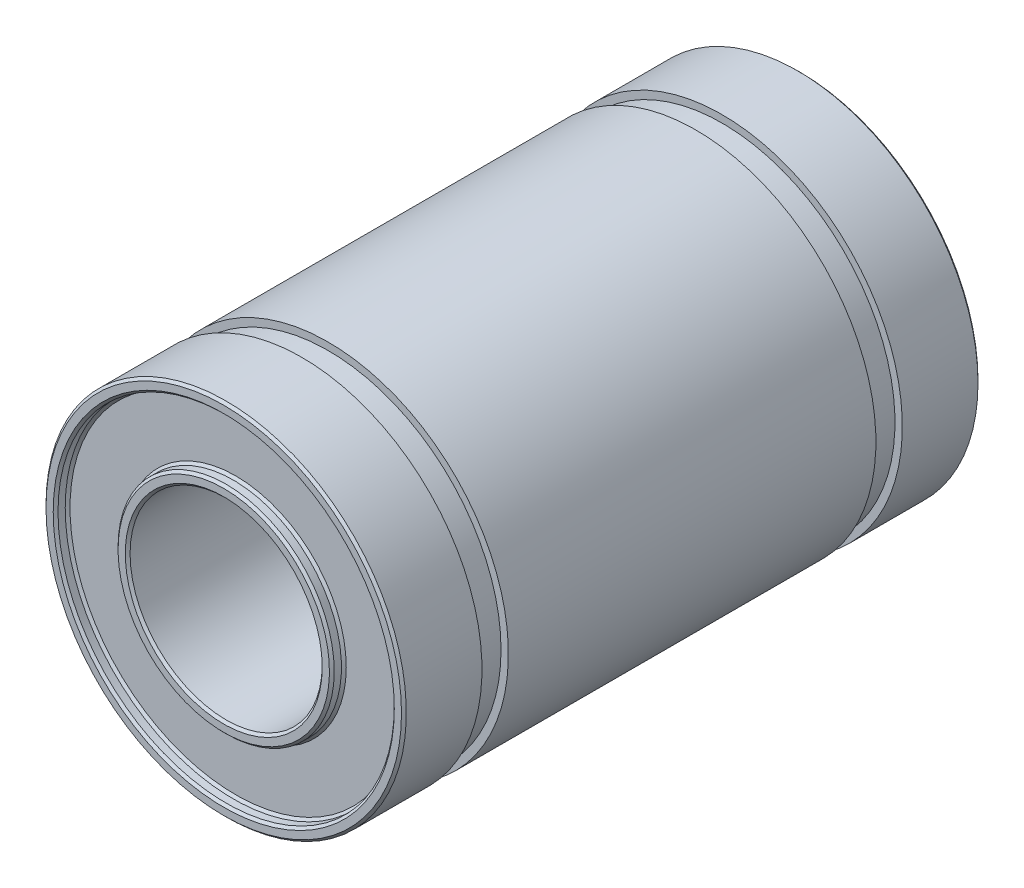
ISO-10303-21;
HEADER;
FILE_DESCRIPTION(('STEP AP214'),'2;1');
FILE_NAME('part.step','',(''),(''),'','','');
FILE_SCHEMA(('AUTOMOTIVE_DESIGN { 1 0 10303 214 1 1 1 1 }'));
ENDSEC;
DATA;
#1=APPLICATION_CONTEXT('core data for automotive mechanical design processes');
#2=APPLICATION_PROTOCOL_DEFINITION('international standard','automotive_design',2000,#1);
#3=PRODUCT_CONTEXT('',#1,'mechanical');
#4=PRODUCT('Part','Part','',(#3));
#5=PRODUCT_RELATED_PRODUCT_CATEGORY('part','',(#4));
#6=PRODUCT_DEFINITION_FORMATION('','',#4);
#7=PRODUCT_DEFINITION_CONTEXT('part definition',#1,'design');
#8=PRODUCT_DEFINITION('design','',#6,#7);
#9=PRODUCT_DEFINITION_SHAPE('','',#8);
#10=(LENGTH_UNIT() NAMED_UNIT(*) SI_UNIT(.MILLI.,.METRE.));
#11=(NAMED_UNIT(*) PLANE_ANGLE_UNIT() SI_UNIT($,.RADIAN.));
#12=(NAMED_UNIT(*) SI_UNIT($,.STERADIAN.) SOLID_ANGLE_UNIT());
#13=UNCERTAINTY_MEASURE_WITH_UNIT(LENGTH_MEASURE(1.E-05),#10,'distance_accuracy_value','');
#14=(GEOMETRIC_REPRESENTATION_CONTEXT(3) GLOBAL_UNCERTAINTY_ASSIGNED_CONTEXT((#13)) GLOBAL_UNIT_ASSIGNED_CONTEXT((#10,
#11,#12)) REPRESENTATION_CONTEXT('',''));
#15=CARTESIAN_POINT('',(0.,0.,0.));
#16=DIRECTION('',(0.,0.,1.));
#17=DIRECTION('',(1.,0.,0.));
#18=AXIS2_PLACEMENT_3D('',#15,#16,#17);
#19=CARTESIAN_POINT('',(0.,0.,23.9999999998872));
#20=DIRECTION('',(0.,0.,1.));
#21=DIRECTION('',(1.,0.,0.));
#22=AXIS2_PLACEMENT_3D('',#19,#20,#21);
#23=CONICAL_SURFACE('',#22,4.09999999988031,0.785398163397448);
#24=CARTESIAN_POINT('',(0.,0.,23.9));
#25=DIRECTION('',(0.,0.,1.));
#26=DIRECTION('',(1.,0.,0.));
#27=AXIS2_PLACEMENT_3D('',#24,#25,#26);
#28=CIRCLE('',#27,4.);
#29=CARTESIAN_POINT('',(4.,0.,23.9));
#30=VERTEX_POINT('',#29);
#31=EDGE_CURVE('E29',#30,#30,#28,.F.);
#32=ORIENTED_EDGE('',*,*,#31,.T.);
#33=EDGE_LOOP('',(#32));
#34=FACE_BOUND('',#33,.T.);
#35=CARTESIAN_POINT('',(0.,0.,24.0000000000009));
#36=DIRECTION('',(0.,0.,1.));
#37=DIRECTION('',(1.,0.,0.));
#38=AXIS2_PLACEMENT_3D('',#35,#36,#37);
#39=CIRCLE('',#38,4.099999999994);
#40=CARTESIAN_POINT('',(4.099999999994,0.,24.0000000000009));
#41=VERTEX_POINT('',#40);
#42=EDGE_CURVE('E17',#41,#41,#39,.F.);
#43=ORIENTED_EDGE('',*,*,#42,.F.);
#44=EDGE_LOOP('',(#43));
#45=FACE_BOUND('',#44,.T.);
#46=ADVANCED_FACE('F14',(#34,#45),#23,.F.);
#47=CARTESIAN_POINT('',(0.,0.,0.));
#48=DIRECTION('',(0.,0.,1.));
#49=DIRECTION('',(1.,0.,0.));
#50=AXIS2_PLACEMENT_3D('',#47,#48,#49);
#51=CYLINDRICAL_SURFACE('',#50,4.);
#52=ORIENTED_EDGE('',*,*,#31,.F.);
#53=EDGE_LOOP('',(#52));
#54=FACE_BOUND('',#53,.T.);
#55=CARTESIAN_POINT('',(0.,0.,0.0999999999748979));
#56=DIRECTION('',(0.,0.,-1.));
#57=DIRECTION('',(-1.,0.,0.));
#58=AXIS2_PLACEMENT_3D('',#55,#56,#57);
#59=CIRCLE('',#58,3.99999999996226);
#60=CARTESIAN_POINT('',(-3.99999999996226,0.,0.0999999999748979));
#61=VERTEX_POINT('',#60);
#62=EDGE_CURVE('E89',#61,#61,#59,.T.);
#63=ORIENTED_EDGE('',*,*,#62,.T.);
#64=EDGE_LOOP('',(#63));
#65=FACE_BOUND('',#64,.T.);
#66=ADVANCED_FACE('F427',(#54,#65),#51,.F.);
#67=CARTESIAN_POINT('',(0.,0.,24.));
#68=DIRECTION('',(0.,0.,1.));
#69=DIRECTION('',(1.,0.,0.));
#70=AXIS2_PLACEMENT_3D('',#67,#68,#69);
#71=PLANE('',#70);
#72=ORIENTED_EDGE('',*,*,#42,.T.);
#73=EDGE_LOOP('',(#72));
#74=FACE_BOUND('',#73,.T.);
#75=CARTESIAN_POINT('',(0.,0.,24.0000000000578));
#76=DIRECTION('',(0.,0.,-1.));
#77=DIRECTION('',(0.,1.,0.));
#78=AXIS2_PLACEMENT_3D('',#75,#76,#77);
#79=CIRCLE('',#78,4.39999999997553);
#80=CARTESIAN_POINT('',(0.,4.39999999997553,24.0000000000578));
#81=VERTEX_POINT('',#80);
#82=EDGE_CURVE('E87',#81,#81,#79,.T.);
#83=ORIENTED_EDGE('',*,*,#82,.F.);
#84=EDGE_LOOP('',(#83));
#85=FACE_BOUND('',#84,.T.);
#86=ADVANCED_FACE('F418',(#74,#85),#71,.T.);
#87=CARTESIAN_POINT('',(0.,0.,0.));
#88=DIRECTION('',(0.,0.,-1.));
#89=DIRECTION('',(-1.,0.,0.));
#90=AXIS2_PLACEMENT_3D('',#87,#88,#89);
#91=CONICAL_SURFACE('',#90,4.099999999994,0.785398163397448);
#92=CARTESIAN_POINT('',(0.,0.,0.));
#93=DIRECTION('',(0.,0.,-1.));
#94=DIRECTION('',(-1.,0.,0.));
#95=AXIS2_PLACEMENT_3D('',#92,#93,#94);
#96=CIRCLE('',#95,4.099999999994);
#97=CARTESIAN_POINT('',(-4.099999999994,0.,0.));
#98=VERTEX_POINT('',#97);
#99=EDGE_CURVE('E85',#98,#98,#96,.T.);
#100=ORIENTED_EDGE('',*,*,#99,.T.);
#101=EDGE_LOOP('',(#100));
#102=FACE_BOUND('',#101,.T.);
#103=ORIENTED_EDGE('',*,*,#62,.F.);
#104=EDGE_LOOP('',(#103));
#105=FACE_BOUND('',#104,.T.);
#106=ADVANCED_FACE('F410',(#102,#105),#91,.F.);
#107=CARTESIAN_POINT('',(0.,0.,23.9000000000829));
#108=DIRECTION('',(0.,0.,-1.));
#109=DIRECTION('',(0.,1.,0.));
#110=AXIS2_PLACEMENT_3D('',#107,#108,#109);
#111=CONICAL_SURFACE('',#110,4.50000000000728,0.785398163681665);
#112=ORIENTED_EDGE('',*,*,#82,.T.);
#113=EDGE_LOOP('',(#112));
#114=FACE_BOUND('',#113,.T.);
#115=CARTESIAN_POINT('',(0.,0.,23.9));
#116=DIRECTION('',(0.,0.,-1.));
#117=DIRECTION('',(-1.,0.,0.));
#118=AXIS2_PLACEMENT_3D('',#115,#116,#117);
#119=CIRCLE('',#118,4.5);
#120=CARTESIAN_POINT('',(-4.5,0.,23.9));
#121=VERTEX_POINT('',#120);
#122=EDGE_CURVE('E84',#121,#121,#119,.T.);
#123=ORIENTED_EDGE('',*,*,#122,.F.);
#124=EDGE_LOOP('',(#123));
#125=FACE_BOUND('',#124,.T.);
#126=ADVANCED_FACE('F401',(#114,#125),#111,.T.);
#127=CARTESIAN_POINT('',(0.,0.,0.));
#128=DIRECTION('',(0.,0.,1.));
#129=DIRECTION('',(1.,0.,0.));
#130=AXIS2_PLACEMENT_3D('',#127,#128,#129);
#131=PLANE('',#130);
#132=CARTESIAN_POINT('',(0.,0.,-5.6843418860808E-11));
#133=DIRECTION('',(0.,0.,1.));
#134=DIRECTION('',(0.,-1.,0.));
#135=AXIS2_PLACEMENT_3D('',#132,#133,#134);
#136=CIRCLE('',#135,4.39999999997553);
#137=CARTESIAN_POINT('',(0.,-4.39999999997553,-5.68434122351281E-11));
#138=VERTEX_POINT('',#137);
#139=EDGE_CURVE('E80',#138,#138,#136,.T.);
#140=ORIENTED_EDGE('',*,*,#139,.F.);
#141=EDGE_LOOP('',(#140));
#142=FACE_BOUND('',#141,.T.);
#143=ORIENTED_EDGE('',*,*,#99,.F.);
#144=EDGE_LOOP('',(#143));
#145=FACE_BOUND('',#144,.T.);
#146=ADVANCED_FACE('F392',(#142,#145),#131,.F.);
#147=CARTESIAN_POINT('',(0.,0.,36.7279220613579));
#148=DIRECTION('',(0.,0.,-1.));
#149=DIRECTION('',(-1.,0.,0.));
#150=AXIS2_PLACEMENT_3D('',#147,#148,#149);
#151=CYLINDRICAL_SURFACE('',#150,4.5);
#152=ORIENTED_EDGE('',*,*,#122,.T.);
#153=EDGE_LOOP('',(#152));
#154=FACE_BOUND('',#153,.T.);
#155=CARTESIAN_POINT('',(0.,0.,23.6000000000445));
#156=DIRECTION('',(0.,0.,-1.));
#157=DIRECTION('',(-1.,0.,0.));
#158=AXIS2_PLACEMENT_3D('',#155,#156,#157);
#159=CIRCLE('',#158,4.50000000000728);
#160=CARTESIAN_POINT('',(-4.50000000000728,0.,23.6000000000445));
#161=VERTEX_POINT('',#160);
#162=EDGE_CURVE('E83',#161,#161,#159,.T.);
#163=ORIENTED_EDGE('',*,*,#162,.F.);
#164=EDGE_LOOP('',(#163));
#165=FACE_BOUND('',#164,.T.);
#166=ADVANCED_FACE('F383',(#154,#165),#151,.T.);
#167=CARTESIAN_POINT('',(0.,0.,0.0999999999748979));
#168=DIRECTION('',(0.,0.,1.));
#169=DIRECTION('',(0.,-1.,0.));
#170=AXIS2_PLACEMENT_3D('',#167,#168,#169);
#171=CONICAL_SURFACE('',#170,4.50000000000728,0.785398163397448);
#172=ORIENTED_EDGE('',*,*,#139,.T.);
#173=EDGE_LOOP('',(#172));
#174=FACE_BOUND('',#173,.T.);
#175=CARTESIAN_POINT('',(0.,0.,0.100000000000003));
#176=DIRECTION('',(0.,0.,1.));
#177=DIRECTION('',(1.,0.,0.));
#178=AXIS2_PLACEMENT_3D('',#175,#176,#177);
#179=CIRCLE('',#178,4.5);
#180=CARTESIAN_POINT('',(4.5,0.,0.100000000000003));
#181=VERTEX_POINT('',#180);
#182=EDGE_CURVE('E79',#181,#181,#179,.T.);
#183=ORIENTED_EDGE('',*,*,#182,.F.);
#184=EDGE_LOOP('',(#183));
#185=FACE_BOUND('',#184,.T.);
#186=ADVANCED_FACE('F374',(#174,#185),#171,.T.);
#187=CARTESIAN_POINT('',(0.,0.,23.5000000000127));
#188=DIRECTION('',(0.,0.,-1.));
#189=DIRECTION('',(-1.,0.,0.));
#190=AXIS2_PLACEMENT_3D('',#187,#188,#189);
#191=CONICAL_SURFACE('',#190,4.59999999998217,0.785398163113231);
#192=ORIENTED_EDGE('',*,*,#162,.T.);
#193=EDGE_LOOP('',(#192));
#194=FACE_BOUND('',#193,.T.);
#195=CARTESIAN_POINT('',(0.,0.,23.5000000000127));
#196=DIRECTION('',(0.,0.,-1.));
#197=DIRECTION('',(-1.,0.,0.));
#198=AXIS2_PLACEMENT_3D('',#195,#196,#197);
#199=CIRCLE('',#198,4.59999999998217);
#200=CARTESIAN_POINT('',(-4.59999999998217,0.,23.5000000000127));
#201=VERTEX_POINT('',#200);
#202=EDGE_CURVE('E76',#201,#201,#199,.T.);
#203=ORIENTED_EDGE('',*,*,#202,.F.);
#204=EDGE_LOOP('',(#203));
#205=FACE_BOUND('',#204,.T.);
#206=ADVANCED_FACE('F365',(#194,#205),#191,.T.);
#207=CARTESIAN_POINT('',(0.,0.,-12.7279220613579));
#208=DIRECTION('',(0.,0.,1.));
#209=DIRECTION('',(1.,0.,0.));
#210=AXIS2_PLACEMENT_3D('',#207,#208,#209);
#211=CYLINDRICAL_SURFACE('',#210,4.5);
#212=ORIENTED_EDGE('',*,*,#182,.T.);
#213=EDGE_LOOP('',(#212));
#214=FACE_BOUND('',#213,.T.);
#215=CARTESIAN_POINT('',(0.,0.,0.400000000013279));
#216=DIRECTION('',(0.,0.,1.));
#217=DIRECTION('',(1.,0.,0.));
#218=AXIS2_PLACEMENT_3D('',#215,#216,#217);
#219=CIRCLE('',#218,4.50000000000728);
#220=CARTESIAN_POINT('',(4.50000000000728,0.,0.400000000013279));
#221=VERTEX_POINT('',#220);
#222=EDGE_CURVE('E75',#221,#221,#219,.T.);
#223=ORIENTED_EDGE('',*,*,#222,.F.);
#224=EDGE_LOOP('',(#223));
#225=FACE_BOUND('',#224,.T.);
#226=ADVANCED_FACE('F167',(#214,#225),#211,.T.);
#227=CARTESIAN_POINT('',(0.,0.,23.5));
#228=DIRECTION('',(0.,0.,1.));
#229=DIRECTION('',(1.,0.,0.));
#230=AXIS2_PLACEMENT_3D('',#227,#228,#229);
#231=PLANE('',#230);
#232=CARTESIAN_POINT('',(0.,0.,23.5000000000127));
#233=DIRECTION('',(0.,0.,1.));
#234=DIRECTION('',(1.,0.,0.));
#235=AXIS2_PLACEMENT_3D('',#232,#233,#234);
#236=CIRCLE('',#235,6.9000000000301);
#237=CARTESIAN_POINT('',(6.9000000000301,0.,23.5000000000127));
#238=VERTEX_POINT('',#237);
#239=EDGE_CURVE('E72',#238,#238,#236,.T.);
#240=ORIENTED_EDGE('',*,*,#239,.T.);
#241=EDGE_LOOP('',(#240));
#242=FACE_BOUND('',#241,.T.);
#243=ORIENTED_EDGE('',*,*,#202,.T.);
#244=EDGE_LOOP('',(#243));
#245=FACE_BOUND('',#244,.T.);
#246=ADVANCED_FACE('F157',(#242,#245),#231,.T.);
#247=CARTESIAN_POINT('',(0.,0.,0.50000000004502));
#248=DIRECTION('',(0.,0.,1.));
#249=DIRECTION('',(1.,0.,0.));
#250=AXIS2_PLACEMENT_3D('',#247,#248,#249);
#251=CONICAL_SURFACE('',#250,4.60000000003902,0.785398163397448);
#252=ORIENTED_EDGE('',*,*,#222,.T.);
#253=EDGE_LOOP('',(#252));
#254=FACE_BOUND('',#253,.T.);
#255=CARTESIAN_POINT('',(0.,0.,0.50000000004502));
#256=DIRECTION('',(0.,0.,1.));
#257=DIRECTION('',(1.,0.,0.));
#258=AXIS2_PLACEMENT_3D('',#255,#256,#257);
#259=CIRCLE('',#258,4.60000000003902);
#260=CARTESIAN_POINT('',(4.60000000003902,0.,0.50000000004502));
#261=VERTEX_POINT('',#260);
#262=EDGE_CURVE('E69',#261,#261,#259,.T.);
#263=ORIENTED_EDGE('',*,*,#262,.F.);
#264=EDGE_LOOP('',(#263));
#265=FACE_BOUND('',#264,.T.);
#266=ADVANCED_FACE('F155',(#254,#265),#251,.T.);
#267=CARTESIAN_POINT('',(0.,0.,23.5999999999308));
#268=DIRECTION('',(0.,0.,1.));
#269=DIRECTION('',(1.,0.,0.));
#270=AXIS2_PLACEMENT_3D('',#267,#268,#269);
#271=CONICAL_SURFACE('',#270,6.99999999994816,0.785398163397448);
#272=ORIENTED_EDGE('',*,*,#239,.F.);
#273=EDGE_LOOP('',(#272));
#274=FACE_BOUND('',#273,.T.);
#275=CARTESIAN_POINT('',(0.,0.,23.6));
#276=DIRECTION('',(0.,0.,1.));
#277=DIRECTION('',(1.,0.,0.));
#278=AXIS2_PLACEMENT_3D('',#275,#276,#277);
#279=CIRCLE('',#278,7.);
#280=CARTESIAN_POINT('',(7.,0.,23.6));
#281=VERTEX_POINT('',#280);
#282=EDGE_CURVE('E68',#281,#281,#279,.T.);
#283=ORIENTED_EDGE('',*,*,#282,.T.);
#284=EDGE_LOOP('',(#283));
#285=FACE_BOUND('',#284,.T.);
#286=ADVANCED_FACE('F151',(#274,#285),#271,.F.);
#287=CARTESIAN_POINT('',(0.,0.,0.5));
#288=DIRECTION('',(0.,0.,-1.));
#289=DIRECTION('',(-1.,0.,0.));
#290=AXIS2_PLACEMENT_3D('',#287,#288,#289);
#291=PLANE('',#290);
#292=CARTESIAN_POINT('',(0.,0.,0.5));
#293=DIRECTION('',(0.,0.,-1.));
#294=DIRECTION('',(-1.,0.,0.));
#295=AXIS2_PLACEMENT_3D('',#292,#293,#294);
#296=CIRCLE('',#295,7.);
#297=CARTESIAN_POINT('',(-7.,0.,0.5));
#298=VERTEX_POINT('',#297);
#299=EDGE_CURVE('E64',#298,#298,#296,.T.);
#300=ORIENTED_EDGE('',*,*,#299,.T.);
#301=EDGE_LOOP('',(#300));
#302=FACE_BOUND('',#301,.T.);
#303=ORIENTED_EDGE('',*,*,#262,.T.);
#304=EDGE_LOOP('',(#303));
#305=FACE_BOUND('',#304,.T.);
#306=ADVANCED_FACE('F148',(#302,#305),#291,.T.);
#307=CARTESIAN_POINT('',(0.,0.,23.5));
#308=DIRECTION('',(0.,0.,1.));
#309=DIRECTION('',(1.,0.,0.));
#310=AXIS2_PLACEMENT_3D('',#307,#308,#309);
#311=CYLINDRICAL_SURFACE('',#310,7.);
#312=ORIENTED_EDGE('',*,*,#282,.F.);
#313=EDGE_LOOP('',(#312));
#314=FACE_BOUND('',#313,.T.);
#315=CARTESIAN_POINT('',(0.,0.,23.9));
#316=DIRECTION('',(0.,0.,1.));
#317=DIRECTION('',(1.,0.,0.));
#318=AXIS2_PLACEMENT_3D('',#315,#316,#317);
#319=CIRCLE('',#318,7.);
#320=CARTESIAN_POINT('',(7.,0.,23.9));
#321=VERTEX_POINT('',#320);
#322=EDGE_CURVE('E67',#321,#321,#319,.T.);
#323=ORIENTED_EDGE('',*,*,#322,.T.);
#324=EDGE_LOOP('',(#323));
#325=FACE_BOUND('',#324,.T.);
#326=ADVANCED_FACE('F144',(#314,#325),#311,.F.);
#327=CARTESIAN_POINT('',(0.,0.,0.5));
#328=DIRECTION('',(0.,0.,-1.));
#329=DIRECTION('',(-1.,0.,0.));
#330=AXIS2_PLACEMENT_3D('',#327,#328,#329);
#331=CYLINDRICAL_SURFACE('',#330,7.);
#332=CARTESIAN_POINT('',(0.,0.,0.0999999999999951));
#333=DIRECTION('',(0.,0.,-1.));
#334=DIRECTION('',(-1.,0.,0.));
#335=AXIS2_PLACEMENT_3D('',#332,#333,#334);
#336=CIRCLE('',#335,7.);
#337=CARTESIAN_POINT('',(-7.,0.,0.0999999999999951));
#338=VERTEX_POINT('',#337);
#339=EDGE_CURVE('E63',#338,#338,#336,.T.);
#340=ORIENTED_EDGE('',*,*,#339,.T.);
#341=EDGE_LOOP('',(#340));
#342=FACE_BOUND('',#341,.T.);
#343=ORIENTED_EDGE('',*,*,#299,.F.);
#344=EDGE_LOOP('',(#343));
#345=FACE_BOUND('',#344,.T.);
#346=ADVANCED_FACE('F141',(#342,#345),#331,.F.);
#347=CARTESIAN_POINT('',(0.,0.,24.));
#348=DIRECTION('',(0.,0.,1.));
#349=DIRECTION('',(1.,0.,0.));
#350=AXIS2_PLACEMENT_3D('',#347,#348,#349);
#351=CONICAL_SURFACE('',#350,7.10000000000001,0.785398163397448);
#352=ORIENTED_EDGE('',*,*,#322,.F.);
#353=EDGE_LOOP('',(#352));
#354=FACE_BOUND('',#353,.T.);
#355=CARTESIAN_POINT('',(0.,0.,24.));
#356=DIRECTION('',(0.,0.,1.));
#357=DIRECTION('',(1.,0.,0.));
#358=AXIS2_PLACEMENT_3D('',#355,#356,#357);
#359=CIRCLE('',#358,7.10000000000001);
#360=CARTESIAN_POINT('',(7.10000000000001,0.,24.));
#361=VERTEX_POINT('',#360);
#362=EDGE_CURVE('E60',#361,#361,#359,.F.);
#363=ORIENTED_EDGE('',*,*,#362,.F.);
#364=EDGE_LOOP('',(#363));
#365=FACE_BOUND('',#364,.T.);
#366=ADVANCED_FACE('F137',(#354,#365),#351,.F.);
#367=CARTESIAN_POINT('',(0.,0.,0.));
#368=DIRECTION('',(0.,0.,-1.));
#369=DIRECTION('',(0.,1.,0.));
#370=AXIS2_PLACEMENT_3D('',#367,#368,#369);
#371=CONICAL_SURFACE('',#370,7.1,0.785398163397466);
#372=CARTESIAN_POINT('',(0.,0.,0.));
#373=DIRECTION('',(0.,0.,-1.));
#374=DIRECTION('',(0.,1.,0.));
#375=AXIS2_PLACEMENT_3D('',#372,#373,#374);
#376=CIRCLE('',#375,7.1);
#377=CARTESIAN_POINT('',(0.,7.1,0.));
#378=VERTEX_POINT('',#377);
#379=EDGE_CURVE('E57',#378,#378,#376,.T.);
#380=ORIENTED_EDGE('',*,*,#379,.T.);
#381=EDGE_LOOP('',(#380));
#382=FACE_BOUND('',#381,.T.);
#383=ORIENTED_EDGE('',*,*,#339,.F.);
#384=EDGE_LOOP('',(#383));
#385=FACE_BOUND('',#384,.T.);
#386=ADVANCED_FACE('F134',(#382,#385),#371,.F.);
#387=CARTESIAN_POINT('',(0.,0.,24.));
#388=DIRECTION('',(0.,0.,1.));
#389=DIRECTION('',(1.,0.,0.));
#390=AXIS2_PLACEMENT_3D('',#387,#388,#389);
#391=PLANE('',#390);
#392=ORIENTED_EDGE('',*,*,#362,.T.);
#393=EDGE_LOOP('',(#392));
#394=FACE_BOUND('',#393,.T.);
#395=CARTESIAN_POINT('',(0.,0.,24.));
#396=DIRECTION('',(0.,0.,-1.));
#397=DIRECTION('',(-1.,0.,0.));
#398=AXIS2_PLACEMENT_3D('',#395,#396,#397);
#399=CIRCLE('',#398,7.39999999999999);
#400=CARTESIAN_POINT('',(-7.39999999999999,0.,24.));
#401=VERTEX_POINT('',#400);
#402=EDGE_CURVE('E54',#401,#401,#399,.T.);
#403=ORIENTED_EDGE('',*,*,#402,.F.);
#404=EDGE_LOOP('',(#403));
#405=FACE_BOUND('',#404,.T.);
#406=ADVANCED_FACE('F130',(#394,#405),#391,.T.);
#407=CARTESIAN_POINT('',(0.,0.,0.));
#408=DIRECTION('',(0.,0.,1.));
#409=DIRECTION('',(1.,0.,0.));
#410=AXIS2_PLACEMENT_3D('',#407,#408,#409);
#411=PLANE('',#410);
#412=CARTESIAN_POINT('',(0.,0.,0.));
#413=DIRECTION('',(0.,0.,1.));
#414=DIRECTION('',(1.,0.,0.));
#415=AXIS2_PLACEMENT_3D('',#412,#413,#414);
#416=CIRCLE('',#415,7.4);
#417=CARTESIAN_POINT('',(7.4,0.,0.));
#418=VERTEX_POINT('',#417);
#419=EDGE_CURVE('E50',#418,#418,#416,.T.);
#420=ORIENTED_EDGE('',*,*,#419,.F.);
#421=EDGE_LOOP('',(#420));
#422=FACE_BOUND('',#421,.T.);
#423=ORIENTED_EDGE('',*,*,#379,.F.);
#424=EDGE_LOOP('',(#423));
#425=FACE_BOUND('',#424,.T.);
#426=ADVANCED_FACE('F127',(#422,#425),#411,.F.);
#427=CARTESIAN_POINT('',(0.,0.,23.9));
#428=DIRECTION('',(0.,0.,-1.));
#429=DIRECTION('',(-1.,0.,0.));
#430=AXIS2_PLACEMENT_3D('',#427,#428,#429);
#431=CONICAL_SURFACE('',#430,7.5,0.785398163397479);
#432=ORIENTED_EDGE('',*,*,#402,.T.);
#433=EDGE_LOOP('',(#432));
#434=FACE_BOUND('',#433,.T.);
#435=CARTESIAN_POINT('',(0.,0.,23.9));
#436=DIRECTION('',(0.,0.,-1.));
#437=DIRECTION('',(-1.,0.,0.));
#438=AXIS2_PLACEMENT_3D('',#435,#436,#437);
#439=CIRCLE('',#438,7.5);
#440=CARTESIAN_POINT('',(-7.5,0.,23.9));
#441=VERTEX_POINT('',#440);
#442=EDGE_CURVE('E53',#441,#441,#439,.T.);
#443=ORIENTED_EDGE('',*,*,#442,.F.);
#444=EDGE_LOOP('',(#443));
#445=FACE_BOUND('',#444,.T.);
#446=ADVANCED_FACE('F123',(#434,#445),#431,.T.);
#447=CARTESIAN_POINT('',(0.,0.,0.0999999999999995));
#448=DIRECTION('',(0.,0.,1.));
#449=DIRECTION('',(1.,0.,0.));
#450=AXIS2_PLACEMENT_3D('',#447,#448,#449);
#451=CONICAL_SURFACE('',#450,7.5,0.78539816339746);
#452=CARTESIAN_POINT('',(0.,0.,0.0999999999999994));
#453=DIRECTION('',(0.,0.,-1.));
#454=DIRECTION('',(-1.,0.,0.));
#455=AXIS2_PLACEMENT_3D('',#452,#453,#454);
#456=CIRCLE('',#455,7.5);
#457=CARTESIAN_POINT('',(-7.5,0.,0.0999999999999994));
#458=VERTEX_POINT('',#457);
#459=EDGE_CURVE('E49',#458,#458,#456,.F.);
#460=ORIENTED_EDGE('',*,*,#459,.F.);
#461=EDGE_LOOP('',(#460));
#462=FACE_BOUND('',#461,.T.);
#463=ORIENTED_EDGE('',*,*,#419,.T.);
#464=EDGE_LOOP('',(#463));
#465=FACE_BOUND('',#464,.T.);
#466=ADVANCED_FACE('F119',(#462,#465),#451,.T.);
#467=CARTESIAN_POINT('',(0.,0.,24.));
#468=DIRECTION('',(0.,0.,-1.));
#469=DIRECTION('',(-1.,0.,0.));
#470=AXIS2_PLACEMENT_3D('',#467,#468,#469);
#471=CYLINDRICAL_SURFACE('',#470,7.5);
#472=ORIENTED_EDGE('',*,*,#442,.T.);
#473=EDGE_LOOP('',(#472));
#474=FACE_BOUND('',#473,.T.);
#475=CARTESIAN_POINT('',(0.,0.,20.75));
#476=DIRECTION('',(0.,0.,-1.));
#477=DIRECTION('',(-1.,0.,0.));
#478=AXIS2_PLACEMENT_3D('',#475,#476,#477);
#479=CIRCLE('',#478,7.5);
#480=CARTESIAN_POINT('',(-7.5,0.,20.75));
#481=VERTEX_POINT('',#480);
#482=EDGE_CURVE('E46',#481,#481,#479,.F.);
#483=ORIENTED_EDGE('',*,*,#482,.T.);
#484=EDGE_LOOP('',(#483));
#485=FACE_BOUND('',#484,.T.);
#486=ADVANCED_FACE('F122',(#474,#485),#471,.T.);
#487=CARTESIAN_POINT('',(0.,0.,24.));
#488=DIRECTION('',(0.,0.,-1.));
#489=DIRECTION('',(-1.,0.,0.));
#490=AXIS2_PLACEMENT_3D('',#487,#488,#489);
#491=CYLINDRICAL_SURFACE('',#490,7.5);
#492=ORIENTED_EDGE('',*,*,#459,.T.);
#493=EDGE_LOOP('',(#492));
#494=FACE_BOUND('',#493,.T.);
#495=CARTESIAN_POINT('',(0.,0.,3.25));
#496=DIRECTION('',(0.,0.,-1.));
#497=DIRECTION('',(-1.,0.,0.));
#498=AXIS2_PLACEMENT_3D('',#495,#496,#497);
#499=CIRCLE('',#498,7.5);
#500=CARTESIAN_POINT('',(-7.5,0.,3.25));
#501=VERTEX_POINT('',#500);
#502=EDGE_CURVE('E43',#501,#501,#499,.T.);
#503=ORIENTED_EDGE('',*,*,#502,.T.);
#504=EDGE_LOOP('',(#503));
#505=FACE_BOUND('',#504,.T.);
#506=ADVANCED_FACE('F116',(#494,#505),#491,.T.);
#507=CARTESIAN_POINT('',(0.,0.,20.75));
#508=DIRECTION('',(0.,0.,1.));
#509=DIRECTION('',(1.,0.,0.));
#510=AXIS2_PLACEMENT_3D('',#507,#508,#509);
#511=PLANE('',#510);
#512=ORIENTED_EDGE('',*,*,#482,.F.);
#513=EDGE_LOOP('',(#512));
#514=FACE_BOUND('',#513,.T.);
#515=CARTESIAN_POINT('',(0.,0.,20.75));
#516=DIRECTION('',(0.,0.,1.));
#517=DIRECTION('',(1.,0.,0.));
#518=AXIS2_PLACEMENT_3D('',#515,#516,#517);
#519=CIRCLE('',#518,7.19355104746334);
#520=CARTESIAN_POINT('',(7.19355104746334,0.,20.75));
#521=VERTEX_POINT('',#520);
#522=EDGE_CURVE('E40',#521,#521,#519,.F.);
#523=ORIENTED_EDGE('',*,*,#522,.F.);
#524=EDGE_LOOP('',(#523));
#525=FACE_BOUND('',#524,.T.);
#526=ADVANCED_FACE('F196',(#514,#525),#511,.F.);
#527=CARTESIAN_POINT('',(0.,0.,3.25));
#528=DIRECTION('',(0.,0.,-1.));
#529=DIRECTION('',(-1.,0.,0.));
#530=AXIS2_PLACEMENT_3D('',#527,#528,#529);
#531=PLANE('',#530);
#532=ORIENTED_EDGE('',*,*,#502,.F.);
#533=EDGE_LOOP('',(#532));
#534=FACE_BOUND('',#533,.T.);
#535=CARTESIAN_POINT('',(0.,0.,3.25));
#536=DIRECTION('',(0.,0.,-1.));
#537=DIRECTION('',(-1.,0.,0.));
#538=AXIS2_PLACEMENT_3D('',#535,#536,#537);
#539=CIRCLE('',#538,7.19355104746334);
#540=CARTESIAN_POINT('',(-7.19355104746334,0.,3.25));
#541=VERTEX_POINT('',#540);
#542=EDGE_CURVE('E37',#541,#541,#539,.F.);
#543=ORIENTED_EDGE('',*,*,#542,.F.);
#544=EDGE_LOOP('',(#543));
#545=FACE_BOUND('',#544,.T.);
#546=ADVANCED_FACE('F192',(#534,#545),#531,.F.);
#547=CARTESIAN_POINT('',(0.,0.,23.9));
#548=DIRECTION('',(0.,0.,1.));
#549=DIRECTION('',(1.,0.,0.));
#550=AXIS2_PLACEMENT_3D('',#547,#548,#549);
#551=CYLINDRICAL_SURFACE('',#550,7.19355104746334);
#552=CARTESIAN_POINT('',(0.,0.,19.65));
#553=DIRECTION('',(0.,0.,1.));
#554=DIRECTION('',(1.,0.,0.));
#555=AXIS2_PLACEMENT_3D('',#552,#553,#554);
#556=CIRCLE('',#555,7.19355104746334);
#557=CARTESIAN_POINT('',(7.19355104746334,0.,19.65));
#558=VERTEX_POINT('',#557);
#559=EDGE_CURVE('E34',#558,#558,#556,.F.);
#560=ORIENTED_EDGE('',*,*,#559,.F.);
#561=EDGE_LOOP('',(#560));
#562=FACE_BOUND('',#561,.T.);
#563=ORIENTED_EDGE('',*,*,#522,.T.);
#564=EDGE_LOOP('',(#563));
#565=FACE_BOUND('',#564,.T.);
#566=ADVANCED_FACE('F188',(#562,#565),#551,.T.);
#567=CARTESIAN_POINT('',(0.,0.,0.0999999999999994));
#568=DIRECTION('',(0.,0.,-1.));
#569=DIRECTION('',(-1.,0.,0.));
#570=AXIS2_PLACEMENT_3D('',#567,#568,#569);
#571=CYLINDRICAL_SURFACE('',#570,7.19355104746334);
#572=ORIENTED_EDGE('',*,*,#542,.T.);
#573=EDGE_LOOP('',(#572));
#574=FACE_BOUND('',#573,.T.);
#575=CARTESIAN_POINT('',(0.,0.,4.35));
#576=DIRECTION('',(0.,0.,-1.));
#577=DIRECTION('',(-1.,0.,0.));
#578=AXIS2_PLACEMENT_3D('',#575,#576,#577);
#579=CIRCLE('',#578,7.19355104746334);
#580=CARTESIAN_POINT('',(-7.19355104746334,0.,4.35));
#581=VERTEX_POINT('',#580);
#582=EDGE_CURVE('E26',#581,#581,#579,.F.);
#583=ORIENTED_EDGE('',*,*,#582,.F.);
#584=EDGE_LOOP('',(#583));
#585=FACE_BOUND('',#584,.T.);
#586=ADVANCED_FACE('F184',(#574,#585),#571,.T.);
#587=CARTESIAN_POINT('',(0.,0.,19.65));
#588=DIRECTION('',(0.,0.,1.));
#589=DIRECTION('',(1.,0.,0.));
#590=AXIS2_PLACEMENT_3D('',#587,#588,#589);
#591=PLANE('',#590);
#592=CARTESIAN_POINT('',(0.,0.,19.65));
#593=DIRECTION('',(0.,0.,-1.));
#594=DIRECTION('',(-1.,0.,0.));
#595=AXIS2_PLACEMENT_3D('',#592,#593,#594);
#596=CIRCLE('',#595,7.5);
#597=CARTESIAN_POINT('',(-7.5,0.,19.65));
#598=VERTEX_POINT('',#597);
#599=EDGE_CURVE('E21',#598,#598,#596,.T.);
#600=ORIENTED_EDGE('',*,*,#599,.F.);
#601=EDGE_LOOP('',(#600));
#602=FACE_BOUND('',#601,.T.);
#603=ORIENTED_EDGE('',*,*,#559,.T.);
#604=EDGE_LOOP('',(#603));
#605=FACE_BOUND('',#604,.T.);
#606=ADVANCED_FACE('F177',(#602,#605),#591,.T.);
#607=CARTESIAN_POINT('',(0.,0.,4.35));
#608=DIRECTION('',(0.,0.,-1.));
#609=DIRECTION('',(-1.,0.,0.));
#610=AXIS2_PLACEMENT_3D('',#607,#608,#609);
#611=PLANE('',#610);
#612=CARTESIAN_POINT('',(0.,0.,4.35));
#613=DIRECTION('',(0.,0.,-1.));
#614=DIRECTION('',(-1.,0.,0.));
#615=AXIS2_PLACEMENT_3D('',#612,#613,#614);
#616=CIRCLE('',#615,7.5);
#617=CARTESIAN_POINT('',(-7.5,0.,4.35));
#618=VERTEX_POINT('',#617);
#619=EDGE_CURVE('E10',#618,#618,#616,.F.);
#620=ORIENTED_EDGE('',*,*,#619,.F.);
#621=EDGE_LOOP('',(#620));
#622=FACE_BOUND('',#621,.T.);
#623=ORIENTED_EDGE('',*,*,#582,.T.);
#624=EDGE_LOOP('',(#623));
#625=FACE_BOUND('',#624,.T.);
#626=ADVANCED_FACE('F172',(#622,#625),#611,.T.);
#627=CARTESIAN_POINT('',(0.,0.,24.));
#628=DIRECTION('',(0.,0.,-1.));
#629=DIRECTION('',(-1.,0.,0.));
#630=AXIS2_PLACEMENT_3D('',#627,#628,#629);
#631=CYLINDRICAL_SURFACE('',#630,7.5);
#632=ORIENTED_EDGE('',*,*,#619,.T.);
#633=EDGE_LOOP('',(#632));
#634=FACE_BOUND('',#633,.T.);
#635=ORIENTED_EDGE('',*,*,#599,.T.);
#636=EDGE_LOOP('',(#635));
#637=FACE_BOUND('',#636,.T.);
#638=ADVANCED_FACE('F170',(#634,#637),#631,.T.);
#639=CLOSED_SHELL('',(#46,#66,#86,#106,#126,#146,#166,#186,#206,#226,#246,#266,#286,#306,#326,
#346,#366,#386,#406,#426,#446,#466,#486,#506,#526,#546,#566,#586,#606,#626,#638));
#640=MANIFOLD_SOLID_BREP('B1',#639);
#641=ADVANCED_BREP_SHAPE_REPRESENTATION('',(#18,#640),#14);
#642=SHAPE_DEFINITION_REPRESENTATION(#9,#641);
ENDSEC;
END-ISO-10303-21;
